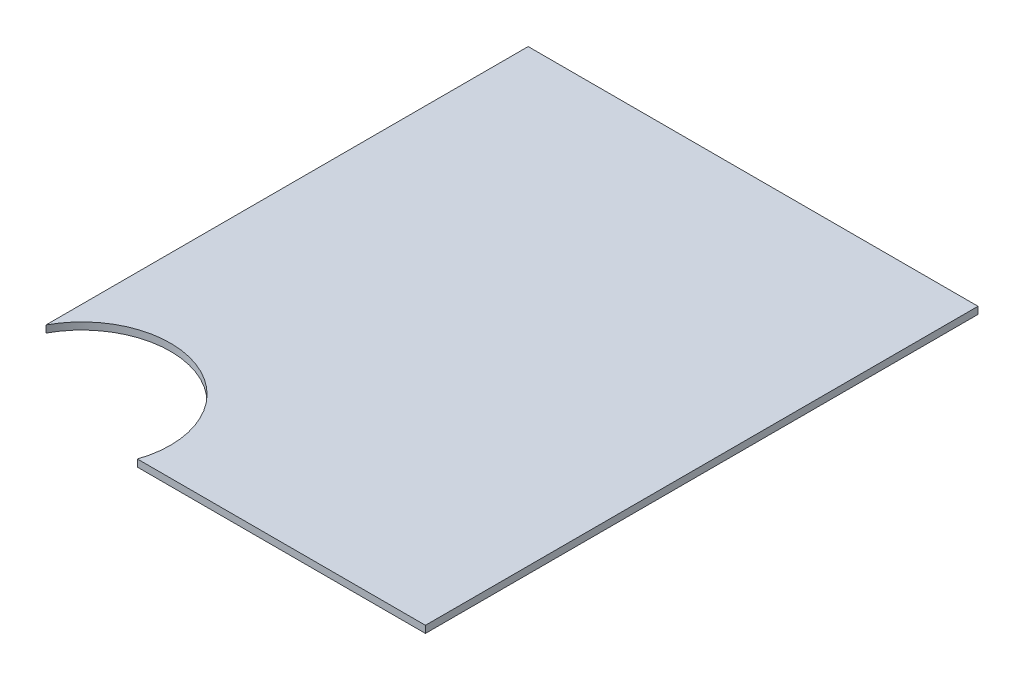
ISO-10303-21;
HEADER;
FILE_DESCRIPTION(('STEP AP214'),'2;1');
FILE_NAME('part.step','',(''),(''),'','','');
FILE_SCHEMA(('AUTOMOTIVE_DESIGN { 1 0 10303 214 1 1 1 1 }'));
ENDSEC;
DATA;
#1=APPLICATION_CONTEXT('core data for automotive mechanical design processes');
#2=APPLICATION_PROTOCOL_DEFINITION('international standard','automotive_design',2000,#1);
#3=PRODUCT_CONTEXT('',#1,'mechanical');
#4=PRODUCT('Part','Part','',(#3));
#5=PRODUCT_RELATED_PRODUCT_CATEGORY('part','',(#4));
#6=PRODUCT_DEFINITION_FORMATION('','',#4);
#7=PRODUCT_DEFINITION_CONTEXT('part definition',#1,'design');
#8=PRODUCT_DEFINITION('design','',#6,#7);
#9=PRODUCT_DEFINITION_SHAPE('','',#8);
#10=(LENGTH_UNIT() NAMED_UNIT(*) SI_UNIT(.MILLI.,.METRE.));
#11=(NAMED_UNIT(*) PLANE_ANGLE_UNIT() SI_UNIT($,.RADIAN.));
#12=(NAMED_UNIT(*) SI_UNIT($,.STERADIAN.) SOLID_ANGLE_UNIT());
#13=UNCERTAINTY_MEASURE_WITH_UNIT(LENGTH_MEASURE(1.E-05),#10,'distance_accuracy_value','');
#14=(GEOMETRIC_REPRESENTATION_CONTEXT(3) GLOBAL_UNCERTAINTY_ASSIGNED_CONTEXT((#13)) GLOBAL_UNIT_ASSIGNED_CONTEXT((#10,
#11,#12)) REPRESENTATION_CONTEXT('',''));
#15=CARTESIAN_POINT('',(0.,0.,0.));
#16=DIRECTION('',(0.,0.,1.));
#17=DIRECTION('',(1.,0.,0.));
#18=AXIS2_PLACEMENT_3D('',#15,#16,#17);
#19=CARTESIAN_POINT('',(-63.4999999999999,2.,78.));
#20=DIRECTION('',(1.,0.,0.));
#21=DIRECTION('',(0.,0.,-1.));
#22=AXIS2_PLACEMENT_3D('',#19,#20,#21);
#23=PLANE('',#22);
#24=DIRECTION('',(0.,0.,1.));
#25=VECTOR('',#24,1.);
#26=CARTESIAN_POINT('',(-63.4999999999999,0.,78.));
#27=LINE('',#26,#25);
#28=CARTESIAN_POINT('',(-63.4999999999999,0.,-78.));
#29=VERTEX_POINT('',#28);
#30=CARTESIAN_POINT('',(-63.4999999999999,0.,58.125657912962));
#31=VERTEX_POINT('',#30);
#32=EDGE_CURVE('E104',#29,#31,#27,.T.);
#33=ORIENTED_EDGE('',*,*,#32,.T.);
#34=DIRECTION('',(0.,1.,0.));
#35=VECTOR('',#34,1.);
#36=CARTESIAN_POINT('',(-63.4999999999999,0.,58.125657912962));
#37=LINE('',#36,#35);
#38=CARTESIAN_POINT('',(-63.4999999999999,2.,58.125657912962));
#39=VERTEX_POINT('',#38);
#40=EDGE_CURVE('E48',#31,#39,#37,.T.);
#41=ORIENTED_EDGE('',*,*,#40,.T.);
#42=DIRECTION('',(0.,0.,1.));
#43=VECTOR('',#42,1.);
#44=CARTESIAN_POINT('',(-63.4999999999999,2.,78.));
#45=LINE('',#44,#43);
#46=CARTESIAN_POINT('',(-63.4999999999999,2.,-78.));
#47=VERTEX_POINT('',#46);
#48=EDGE_CURVE('E111',#47,#39,#45,.T.);
#49=ORIENTED_EDGE('',*,*,#48,.F.);
#50=DIRECTION('',(0.,-1.,0.));
#51=VECTOR('',#50,1.);
#52=CARTESIAN_POINT('',(-63.4999999999999,2.,-78.));
#53=LINE('',#52,#51);
#54=EDGE_CURVE('E112',#47,#29,#53,.T.);
#55=ORIENTED_EDGE('',*,*,#54,.T.);
#56=EDGE_LOOP('',(#33,#41,#49,#55));
#57=FACE_BOUND('',#56,.T.);
#58=ADVANCED_FACE('F34',(#57),#23,.F.);
#59=CARTESIAN_POINT('',(63.5000000000001,2.,77.9999999999999));
#60=DIRECTION('',(0.,0.,-1.));
#61=DIRECTION('',(-1.,0.,0.));
#62=AXIS2_PLACEMENT_3D('',#59,#60,#61);
#63=PLANE('',#62);
#64=DIRECTION('',(1.,0.,0.));
#65=VECTOR('',#64,1.);
#66=CARTESIAN_POINT('',(63.5000000000001,2.,77.9999999999999));
#67=LINE('',#66,#65);
#68=CARTESIAN_POINT('',(-17.8145614353459,2.,78.));
#69=VERTEX_POINT('',#68);
#70=CARTESIAN_POINT('',(63.5000000000001,2.,77.9999999999999));
#71=VERTEX_POINT('',#70);
#72=EDGE_CURVE('E79',#69,#71,#67,.T.);
#73=ORIENTED_EDGE('',*,*,#72,.F.);
#74=DIRECTION('',(0.,1.,0.));
#75=VECTOR('',#74,1.);
#76=CARTESIAN_POINT('',(-17.8145614353459,0.,78.));
#77=LINE('',#76,#75);
#78=CARTESIAN_POINT('',(-17.8145614353459,0.,78.));
#79=VERTEX_POINT('',#78);
#80=EDGE_CURVE('E90',#69,#79,#77,.F.);
#81=ORIENTED_EDGE('',*,*,#80,.T.);
#82=DIRECTION('',(1.,0.,0.));
#83=VECTOR('',#82,1.);
#84=CARTESIAN_POINT('',(63.5000000000001,0.,77.9999999999999));
#85=LINE('',#84,#83);
#86=CARTESIAN_POINT('',(63.5000000000001,0.,77.9999999999999));
#87=VERTEX_POINT('',#86);
#88=EDGE_CURVE('E99',#79,#87,#85,.T.);
#89=ORIENTED_EDGE('',*,*,#88,.T.);
#90=DIRECTION('',(0.,-1.,0.));
#91=VECTOR('',#90,1.);
#92=CARTESIAN_POINT('',(63.5000000000001,2.,77.9999999999999));
#93=LINE('',#92,#91);
#94=EDGE_CURVE('E11',#71,#87,#93,.T.);
#95=ORIENTED_EDGE('',*,*,#94,.F.);
#96=EDGE_LOOP('',(#73,#81,#89,#95));
#97=FACE_BOUND('',#96,.T.);
#98=ADVANCED_FACE('F98',(#97),#63,.F.);
#99=CARTESIAN_POINT('',(63.5000000000001,2.,77.9999999999999));
#100=DIRECTION('',(-1.,0.,0.));
#101=DIRECTION('',(0.,0.,1.));
#102=AXIS2_PLACEMENT_3D('',#99,#100,#101);
#103=PLANE('',#102);
#104=DIRECTION('',(0.,0.,-1.));
#105=VECTOR('',#104,1.);
#106=CARTESIAN_POINT('',(63.5000000000001,0.,77.9999999999999));
#107=LINE('',#106,#105);
#108=CARTESIAN_POINT('',(63.5000000000001,0.,-78.0000000000001));
#109=VERTEX_POINT('',#108);
#110=EDGE_CURVE('E103',#87,#109,#107,.T.);
#111=ORIENTED_EDGE('',*,*,#110,.T.);
#112=DIRECTION('',(0.,-1.,0.));
#113=VECTOR('',#112,1.);
#114=CARTESIAN_POINT('',(63.5000000000001,2.,-78.0000000000001));
#115=LINE('',#114,#113);
#116=CARTESIAN_POINT('',(63.5000000000001,2.,-78.0000000000001));
#117=VERTEX_POINT('',#116);
#118=EDGE_CURVE('E41',#117,#109,#115,.T.);
#119=ORIENTED_EDGE('',*,*,#118,.F.);
#120=DIRECTION('',(0.,0.,-1.));
#121=VECTOR('',#120,1.);
#122=CARTESIAN_POINT('',(63.5000000000001,2.,77.9999999999999));
#123=LINE('',#122,#121);
#124=EDGE_CURVE('E120',#71,#117,#123,.T.);
#125=ORIENTED_EDGE('',*,*,#124,.F.);
#126=ORIENTED_EDGE('',*,*,#94,.T.);
#127=EDGE_LOOP('',(#111,#119,#125,#126));
#128=FACE_BOUND('',#127,.T.);
#129=ADVANCED_FACE('F125',(#128),#103,.F.);
#130=CARTESIAN_POINT('',(63.5000000000001,2.,-78.0000000000001));
#131=DIRECTION('',(0.,0.,1.));
#132=DIRECTION('',(1.,0.,0.));
#133=AXIS2_PLACEMENT_3D('',#130,#131,#132);
#134=PLANE('',#133);
#135=DIRECTION('',(-1.,0.,0.));
#136=VECTOR('',#135,1.);
#137=CARTESIAN_POINT('',(63.5000000000001,0.,-78.0000000000001));
#138=LINE('',#137,#136);
#139=EDGE_CURVE('E74',#109,#29,#138,.T.);
#140=ORIENTED_EDGE('',*,*,#139,.T.);
#141=ORIENTED_EDGE('',*,*,#54,.F.);
#142=DIRECTION('',(-1.,0.,0.));
#143=VECTOR('',#142,1.);
#144=CARTESIAN_POINT('',(63.5000000000001,2.,-78.0000000000001));
#145=LINE('',#144,#143);
#146=EDGE_CURVE('E57',#117,#47,#145,.T.);
#147=ORIENTED_EDGE('',*,*,#146,.F.);
#148=ORIENTED_EDGE('',*,*,#118,.T.);
#149=EDGE_LOOP('',(#140,#141,#147,#148));
#150=FACE_BOUND('',#149,.T.);
#151=ADVANCED_FACE('F114',(#150),#134,.F.);
#152=CARTESIAN_POINT('',(0.,2.,0.));
#153=DIRECTION('',(0.,1.,0.));
#154=DIRECTION('',(0.,0.,1.));
#155=AXIS2_PLACEMENT_3D('',#152,#153,#154);
#156=PLANE('',#155);
#157=CARTESIAN_POINT('',(-41.4999999999999,2.,70.));
#158=DIRECTION('',(0.,1.,0.));
#159=DIRECTION('',(0.,0.,1.));
#160=AXIS2_PLACEMENT_3D('',#157,#158,#159);
#161=CIRCLE('',#160,25.);
#162=EDGE_CURVE('E95',#69,#39,#161,.T.);
#163=ORIENTED_EDGE('',*,*,#162,.F.);
#164=ORIENTED_EDGE('',*,*,#72,.T.);
#165=ORIENTED_EDGE('',*,*,#124,.T.);
#166=ORIENTED_EDGE('',*,*,#146,.T.);
#167=ORIENTED_EDGE('',*,*,#48,.T.);
#168=EDGE_LOOP('',(#163,#164,#165,#166,#167));
#169=FACE_BOUND('',#168,.T.);
#170=ADVANCED_FACE('F124',(#169),#156,.T.);
#171=CARTESIAN_POINT('',(0.,0.,0.));
#172=DIRECTION('',(0.,1.,0.));
#173=DIRECTION('',(0.,0.,1.));
#174=AXIS2_PLACEMENT_3D('',#171,#172,#173);
#175=PLANE('',#174);
#176=ORIENTED_EDGE('',*,*,#88,.F.);
#177=CARTESIAN_POINT('',(-41.4999999999999,0.,70.));
#178=DIRECTION('',(0.,1.,0.));
#179=DIRECTION('',(0.,0.,1.));
#180=AXIS2_PLACEMENT_3D('',#177,#178,#179);
#181=CIRCLE('',#180,25.);
#182=EDGE_CURVE('E87',#79,#31,#181,.T.);
#183=ORIENTED_EDGE('',*,*,#182,.T.);
#184=ORIENTED_EDGE('',*,*,#32,.F.);
#185=ORIENTED_EDGE('',*,*,#139,.F.);
#186=ORIENTED_EDGE('',*,*,#110,.F.);
#187=EDGE_LOOP('',(#176,#183,#184,#185,#186));
#188=FACE_BOUND('',#187,.T.);
#189=ADVANCED_FACE('F102',(#188),#175,.F.);
#190=CARTESIAN_POINT('',(-41.4999999999999,0.,70.));
#191=DIRECTION('',(0.,1.,0.));
#192=DIRECTION('',(0.,0.,1.));
#193=AXIS2_PLACEMENT_3D('',#190,#191,#192);
#194=CYLINDRICAL_SURFACE('',#193,25.);
#195=ORIENTED_EDGE('',*,*,#182,.F.);
#196=ORIENTED_EDGE('',*,*,#80,.F.);
#197=ORIENTED_EDGE('',*,*,#162,.T.);
#198=ORIENTED_EDGE('',*,*,#40,.F.);
#199=EDGE_LOOP('',(#195,#196,#197,#198));
#200=FACE_BOUND('',#199,.T.);
#201=ADVANCED_FACE('F89',(#200),#194,.F.);
#202=CLOSED_SHELL('',(#58,#98,#129,#151,#170,#189,#201));
#203=MANIFOLD_SOLID_BREP('B2',#202);
#204=ADVANCED_BREP_SHAPE_REPRESENTATION('',(#18,#203),#14);
#205=SHAPE_DEFINITION_REPRESENTATION(#9,#204);
ENDSEC;
END-ISO-10303-21;
